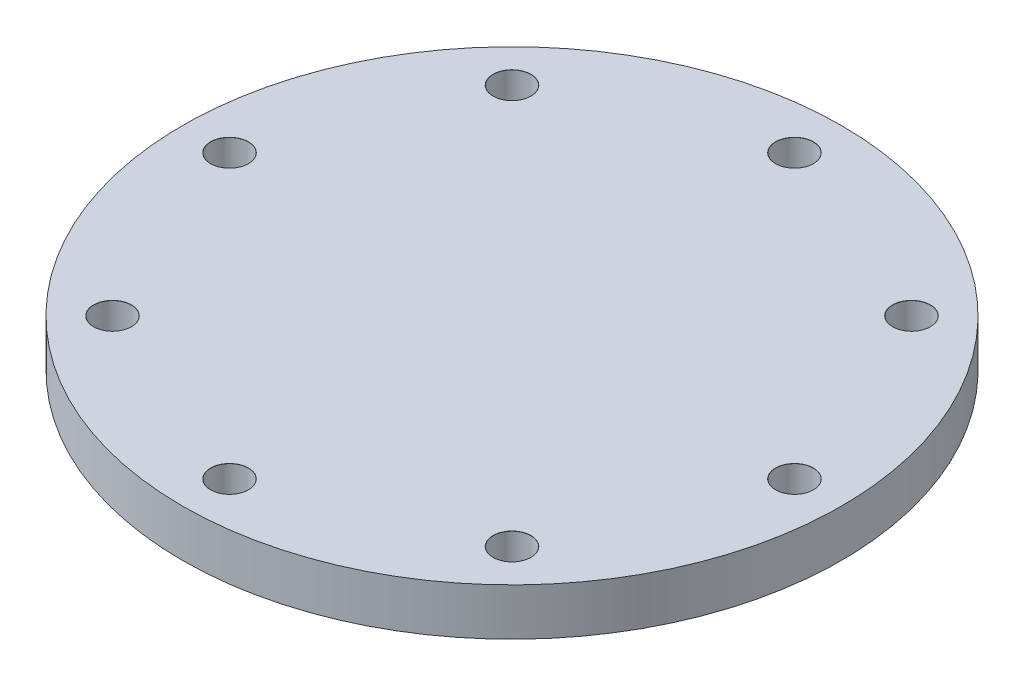
ISO-10303-21;
HEADER;
FILE_DESCRIPTION(('STEP AP214'),'2;1');
FILE_NAME('part.step','',(''),(''),'','','');
FILE_SCHEMA(('AUTOMOTIVE_DESIGN { 1 0 10303 214 1 1 1 1 }'));
ENDSEC;
DATA;
#1=APPLICATION_CONTEXT('core data for automotive mechanical design processes');
#2=APPLICATION_PROTOCOL_DEFINITION('international standard','automotive_design',2000,#1);
#3=PRODUCT_CONTEXT('',#1,'mechanical');
#4=PRODUCT('Part','Part','',(#3));
#5=PRODUCT_RELATED_PRODUCT_CATEGORY('part','',(#4));
#6=PRODUCT_DEFINITION_FORMATION('','',#4);
#7=PRODUCT_DEFINITION_CONTEXT('part definition',#1,'design');
#8=PRODUCT_DEFINITION('design','',#6,#7);
#9=PRODUCT_DEFINITION_SHAPE('','',#8);
#10=(LENGTH_UNIT() NAMED_UNIT(*) SI_UNIT(.MILLI.,.METRE.));
#11=(NAMED_UNIT(*) PLANE_ANGLE_UNIT() SI_UNIT($,.RADIAN.));
#12=(NAMED_UNIT(*) SI_UNIT($,.STERADIAN.) SOLID_ANGLE_UNIT());
#13=UNCERTAINTY_MEASURE_WITH_UNIT(LENGTH_MEASURE(1.E-05),#10,'distance_accuracy_value','');
#14=(GEOMETRIC_REPRESENTATION_CONTEXT(3) GLOBAL_UNCERTAINTY_ASSIGNED_CONTEXT((#13)) GLOBAL_UNIT_ASSIGNED_CONTEXT((#10,
#11,#12)) REPRESENTATION_CONTEXT('',''));
#15=CARTESIAN_POINT('',(0.,0.,0.));
#16=DIRECTION('',(0.,0.,1.));
#17=DIRECTION('',(1.,0.,0.));
#18=AXIS2_PLACEMENT_3D('',#15,#16,#17);
#19=CARTESIAN_POINT('',(0.,9.99999999999999,0.));
#20=DIRECTION('',(0.,1.,0.));
#21=DIRECTION('',(0.,0.,1.));
#22=AXIS2_PLACEMENT_3D('',#19,#20,#21);
#23=PLANE('',#22);
#24=CARTESIAN_POINT('',(-42.4264068711934,9.99999999999999,42.4264068711923));
#25=DIRECTION('',(0.,1.,0.));
#26=DIRECTION('',(0.,0.,1.));
#27=AXIS2_PLACEMENT_3D('',#24,#25,#26);
#28=CIRCLE('',#27,4.025);
#29=CARTESIAN_POINT('',(-42.4264068711934,9.99999999999999,46.4514068711923));
#30=VERTEX_POINT('',#29);
#31=EDGE_CURVE('E118',#30,#30,#28,.T.);
#32=ORIENTED_EDGE('',*,*,#31,.F.);
#33=EDGE_LOOP('',(#32));
#34=FACE_BOUND('',#33,.T.);
#35=CARTESIAN_POINT('',(-6.28466640991764E-13,9.99999999999999,60.));
#36=DIRECTION('',(0.,1.,0.));
#37=DIRECTION('',(0.,0.,1.));
#38=AXIS2_PLACEMENT_3D('',#35,#36,#37);
#39=CIRCLE('',#38,4.025);
#40=CARTESIAN_POINT('',(-6.28466640991764E-13,9.99999999999999,64.025));
#41=VERTEX_POINT('',#40);
#42=EDGE_CURVE('E109',#41,#41,#39,.T.);
#43=ORIENTED_EDGE('',*,*,#42,.F.);
#44=EDGE_LOOP('',(#43));
#45=FACE_BOUND('',#44,.T.);
#46=CARTESIAN_POINT('',(42.4264068711925,9.99999999999999,42.4264068711932));
#47=DIRECTION('',(0.,1.,0.));
#48=DIRECTION('',(0.,0.,1.));
#49=AXIS2_PLACEMENT_3D('',#46,#47,#48);
#50=CIRCLE('',#49,4.025);
#51=CARTESIAN_POINT('',(42.4264068711925,9.99999999999999,46.4514068711932));
#52=VERTEX_POINT('',#51);
#53=EDGE_CURVE('E100',#52,#52,#50,.T.);
#54=ORIENTED_EDGE('',*,*,#53,.F.);
#55=EDGE_LOOP('',(#54));
#56=FACE_BOUND('',#55,.T.);
#57=CARTESIAN_POINT('',(60.,9.99999999999999,0.));
#58=DIRECTION('',(0.,1.,0.));
#59=DIRECTION('',(0.,0.,1.));
#60=AXIS2_PLACEMENT_3D('',#57,#58,#59);
#61=CIRCLE('',#60,4.025);
#62=CARTESIAN_POINT('',(60.,9.99999999999999,4.025));
#63=VERTEX_POINT('',#62);
#64=EDGE_CURVE('E91',#63,#63,#61,.T.);
#65=ORIENTED_EDGE('',*,*,#64,.F.);
#66=EDGE_LOOP('',(#65));
#67=FACE_BOUND('',#66,.T.);
#68=CARTESIAN_POINT('',(42.4264068711931,9.99999999999999,-42.4264068711926));
#69=DIRECTION('',(0.,1.,0.));
#70=DIRECTION('',(0.,0.,1.));
#71=AXIS2_PLACEMENT_3D('',#68,#69,#70);
#72=CIRCLE('',#71,4.025);
#73=CARTESIAN_POINT('',(42.4264068711931,9.99999999999999,-38.4014068711926));
#74=VERTEX_POINT('',#73);
#75=EDGE_CURVE('E82',#74,#74,#72,.T.);
#76=ORIENTED_EDGE('',*,*,#75,.F.);
#77=EDGE_LOOP('',(#76));
#78=FACE_BOUND('',#77,.T.);
#79=CARTESIAN_POINT('',(2.09488880330588E-13,9.99999999999999,-60.));
#80=DIRECTION('',(0.,1.,0.));
#81=DIRECTION('',(0.,0.,1.));
#82=AXIS2_PLACEMENT_3D('',#79,#80,#81);
#83=CIRCLE('',#82,4.025);
#84=CARTESIAN_POINT('',(2.09488880330588E-13,9.99999999999999,-55.975));
#85=VERTEX_POINT('',#84);
#86=EDGE_CURVE('E73',#85,#85,#83,.T.);
#87=ORIENTED_EDGE('',*,*,#86,.F.);
#88=EDGE_LOOP('',(#87));
#89=FACE_BOUND('',#88,.T.);
#90=CARTESIAN_POINT('',(-42.4264068711928,9.99999999999999,-42.4264068711929));
#91=DIRECTION('',(0.,1.,0.));
#92=DIRECTION('',(0.,0.,1.));
#93=AXIS2_PLACEMENT_3D('',#90,#91,#92);
#94=CIRCLE('',#93,4.025);
#95=CARTESIAN_POINT('',(-42.4264068711928,9.99999999999999,-38.4014068711929));
#96=VERTEX_POINT('',#95);
#97=EDGE_CURVE('E64',#96,#96,#94,.T.);
#98=ORIENTED_EDGE('',*,*,#97,.F.);
#99=EDGE_LOOP('',(#98));
#100=FACE_BOUND('',#99,.T.);
#101=CARTESIAN_POINT('',(-60.,9.99999999999999,0.));
#102=DIRECTION('',(0.,1.,0.));
#103=DIRECTION('',(0.,0.,1.));
#104=AXIS2_PLACEMENT_3D('',#101,#102,#103);
#105=CIRCLE('',#104,4.025);
#106=CARTESIAN_POINT('',(-60.,9.99999999999999,4.025));
#107=VERTEX_POINT('',#106);
#108=EDGE_CURVE('E55',#107,#107,#105,.T.);
#109=ORIENTED_EDGE('',*,*,#108,.F.);
#110=EDGE_LOOP('',(#109));
#111=FACE_BOUND('',#110,.T.);
#112=CARTESIAN_POINT('',(0.,9.99999999999999,0.));
#113=DIRECTION('',(0.,1.,0.));
#114=DIRECTION('',(0.,0.,1.));
#115=AXIS2_PLACEMENT_3D('',#112,#113,#114);
#116=CIRCLE('',#115,70.);
#117=CARTESIAN_POINT('',(0.,9.99999999999999,70.));
#118=VERTEX_POINT('',#117);
#119=EDGE_CURVE('E10',#118,#118,#116,.T.);
#120=ORIENTED_EDGE('',*,*,#119,.T.);
#121=EDGE_LOOP('',(#120));
#122=FACE_BOUND('',#121,.T.);
#123=ADVANCED_FACE('F36',(#34,#45,#56,#67,#78,#89,#100,#111,#122),#23,.T.);
#124=CARTESIAN_POINT('',(0.,76.6194972326676,0.));
#125=DIRECTION('',(0.,1.,0.));
#126=DIRECTION('',(0.,0.,1.));
#127=AXIS2_PLACEMENT_3D('',#124,#125,#126);
#128=CYLINDRICAL_SURFACE('',#127,70.);
#129=CARTESIAN_POINT('',(0.,0.,0.));
#130=DIRECTION('',(0.,1.,0.));
#131=DIRECTION('',(0.,0.,1.));
#132=AXIS2_PLACEMENT_3D('',#129,#130,#131);
#133=CIRCLE('',#132,70.);
#134=CARTESIAN_POINT('',(0.,0.,70.));
#135=VERTEX_POINT('',#134);
#136=EDGE_CURVE('E42',#135,#135,#133,.T.);
#137=ORIENTED_EDGE('',*,*,#136,.T.);
#138=EDGE_LOOP('',(#137));
#139=FACE_BOUND('',#138,.T.);
#140=ORIENTED_EDGE('',*,*,#119,.F.);
#141=EDGE_LOOP('',(#140));
#142=FACE_BOUND('',#141,.T.);
#143=ADVANCED_FACE('F126',(#139,#142),#128,.T.);
#144=CARTESIAN_POINT('',(0.,0.,0.));
#145=DIRECTION('',(0.,-1.,0.));
#146=DIRECTION('',(0.,0.,-1.));
#147=AXIS2_PLACEMENT_3D('',#144,#145,#146);
#148=PLANE('',#147);
#149=CARTESIAN_POINT('',(-42.4264068711934,0.,42.4264068711923));
#150=DIRECTION('',(0.,1.,0.));
#151=DIRECTION('',(0.,0.,1.));
#152=AXIS2_PLACEMENT_3D('',#149,#150,#151);
#153=CIRCLE('',#152,4.);
#154=CARTESIAN_POINT('',(-42.4264068711934,0.,46.4264068711923));
#155=VERTEX_POINT('',#154);
#156=EDGE_CURVE('E112',#155,#155,#153,.T.);
#157=ORIENTED_EDGE('',*,*,#156,.T.);
#158=EDGE_LOOP('',(#157));
#159=FACE_BOUND('',#158,.T.);
#160=CARTESIAN_POINT('',(-6.28466640991764E-13,0.,60.));
#161=DIRECTION('',(0.,1.,0.));
#162=DIRECTION('',(0.,0.,1.));
#163=AXIS2_PLACEMENT_3D('',#160,#161,#162);
#164=CIRCLE('',#163,4.);
#165=CARTESIAN_POINT('',(-6.28466640991764E-13,0.,64.));
#166=VERTEX_POINT('',#165);
#167=EDGE_CURVE('E103',#166,#166,#164,.T.);
#168=ORIENTED_EDGE('',*,*,#167,.T.);
#169=EDGE_LOOP('',(#168));
#170=FACE_BOUND('',#169,.T.);
#171=CARTESIAN_POINT('',(42.4264068711925,0.,42.4264068711932));
#172=DIRECTION('',(0.,1.,0.));
#173=DIRECTION('',(0.,0.,1.));
#174=AXIS2_PLACEMENT_3D('',#171,#172,#173);
#175=CIRCLE('',#174,4.);
#176=CARTESIAN_POINT('',(42.4264068711925,0.,46.4264068711932));
#177=VERTEX_POINT('',#176);
#178=EDGE_CURVE('E94',#177,#177,#175,.T.);
#179=ORIENTED_EDGE('',*,*,#178,.T.);
#180=EDGE_LOOP('',(#179));
#181=FACE_BOUND('',#180,.T.);
#182=CARTESIAN_POINT('',(60.,0.,0.));
#183=DIRECTION('',(0.,1.,0.));
#184=DIRECTION('',(0.,0.,1.));
#185=AXIS2_PLACEMENT_3D('',#182,#183,#184);
#186=CIRCLE('',#185,4.);
#187=CARTESIAN_POINT('',(60.,0.,4.));
#188=VERTEX_POINT('',#187);
#189=EDGE_CURVE('E85',#188,#188,#186,.T.);
#190=ORIENTED_EDGE('',*,*,#189,.T.);
#191=EDGE_LOOP('',(#190));
#192=FACE_BOUND('',#191,.T.);
#193=CARTESIAN_POINT('',(42.4264068711931,0.,-42.4264068711926));
#194=DIRECTION('',(0.,1.,0.));
#195=DIRECTION('',(0.,0.,1.));
#196=AXIS2_PLACEMENT_3D('',#193,#194,#195);
#197=CIRCLE('',#196,4.);
#198=CARTESIAN_POINT('',(42.4264068711931,0.,-38.4264068711926));
#199=VERTEX_POINT('',#198);
#200=EDGE_CURVE('E76',#199,#199,#197,.T.);
#201=ORIENTED_EDGE('',*,*,#200,.T.);
#202=EDGE_LOOP('',(#201));
#203=FACE_BOUND('',#202,.T.);
#204=CARTESIAN_POINT('',(2.09488880330588E-13,0.,-60.));
#205=DIRECTION('',(0.,1.,0.));
#206=DIRECTION('',(0.,0.,1.));
#207=AXIS2_PLACEMENT_3D('',#204,#205,#206);
#208=CIRCLE('',#207,4.);
#209=CARTESIAN_POINT('',(2.09488880330588E-13,0.,-56.));
#210=VERTEX_POINT('',#209);
#211=EDGE_CURVE('E67',#210,#210,#208,.T.);
#212=ORIENTED_EDGE('',*,*,#211,.T.);
#213=EDGE_LOOP('',(#212));
#214=FACE_BOUND('',#213,.T.);
#215=CARTESIAN_POINT('',(-42.4264068711928,0.,-42.4264068711929));
#216=DIRECTION('',(0.,1.,0.));
#217=DIRECTION('',(0.,0.,1.));
#218=AXIS2_PLACEMENT_3D('',#215,#216,#217);
#219=CIRCLE('',#218,4.);
#220=CARTESIAN_POINT('',(-42.4264068711928,0.,-38.4264068711929));
#221=VERTEX_POINT('',#220);
#222=EDGE_CURVE('E58',#221,#221,#219,.T.);
#223=ORIENTED_EDGE('',*,*,#222,.T.);
#224=EDGE_LOOP('',(#223));
#225=FACE_BOUND('',#224,.T.);
#226=CARTESIAN_POINT('',(-60.,0.,0.));
#227=DIRECTION('',(0.,1.,0.));
#228=DIRECTION('',(0.,0.,1.));
#229=AXIS2_PLACEMENT_3D('',#226,#227,#228);
#230=CIRCLE('',#229,4.);
#231=CARTESIAN_POINT('',(-60.,0.,4.));
#232=VERTEX_POINT('',#231);
#233=EDGE_CURVE('E46',#232,#232,#230,.T.);
#234=ORIENTED_EDGE('',*,*,#233,.T.);
#235=EDGE_LOOP('',(#234));
#236=FACE_BOUND('',#235,.T.);
#237=ORIENTED_EDGE('',*,*,#136,.F.);
#238=EDGE_LOOP('',(#237));
#239=FACE_BOUND('',#238,.T.);
#240=ADVANCED_FACE('F154',(#159,#170,#181,#192,#203,#214,#225,#236,#239),#148,.T.);
#241=CARTESIAN_POINT('',(-60.,9.99999999999999,0.));
#242=DIRECTION('',(0.,1.,0.));
#243=DIRECTION('',(0.,0.,1.));
#244=AXIS2_PLACEMENT_3D('',#241,#242,#243);
#245=CYLINDRICAL_SURFACE('',#244,4.);
#246=ORIENTED_EDGE('',*,*,#233,.F.);
#247=EDGE_LOOP('',(#246));
#248=FACE_BOUND('',#247,.T.);
#249=CARTESIAN_POINT('',(-60.,9.97902250922059,0.));
#250=DIRECTION('',(0.,1.,0.));
#251=DIRECTION('',(0.,0.,1.));
#252=AXIS2_PLACEMENT_3D('',#249,#250,#251);
#253=CIRCLE('',#252,4.);
#254=CARTESIAN_POINT('',(-60.,9.97902250922059,4.));
#255=VERTEX_POINT('',#254);
#256=EDGE_CURVE('E50',#255,#255,#253,.T.);
#257=ORIENTED_EDGE('',*,*,#256,.T.);
#258=EDGE_LOOP('',(#257));
#259=FACE_BOUND('',#258,.T.);
#260=ADVANCED_FACE('F144',(#248,#259),#245,.F.);
#261=CARTESIAN_POINT('',(-60.,9.99999999999999,0.));
#262=DIRECTION('',(0.,1.,0.));
#263=DIRECTION('',(0.,0.,1.));
#264=AXIS2_PLACEMENT_3D('',#261,#262,#263);
#265=CONICAL_SURFACE('',#264,4.025,0.87266462599766);
#266=ORIENTED_EDGE('',*,*,#256,.F.);
#267=EDGE_LOOP('',(#266));
#268=FACE_BOUND('',#267,.T.);
#269=ORIENTED_EDGE('',*,*,#108,.T.);
#270=EDGE_LOOP('',(#269));
#271=FACE_BOUND('',#270,.T.);
#272=ADVANCED_FACE('F141',(#268,#271),#265,.F.);
#273=CARTESIAN_POINT('',(-42.4264068711928,9.99999999999999,-42.4264068711929));
#274=DIRECTION('',(0.,1.,0.));
#275=DIRECTION('',(0.,0.,1.));
#276=AXIS2_PLACEMENT_3D('',#273,#274,#275);
#277=CYLINDRICAL_SURFACE('',#276,4.);
#278=ORIENTED_EDGE('',*,*,#222,.F.);
#279=EDGE_LOOP('',(#278));
#280=FACE_BOUND('',#279,.T.);
#281=CARTESIAN_POINT('',(-42.4264068711928,9.97902250922059,-42.4264068711929));
#282=DIRECTION('',(0.,1.,0.));
#283=DIRECTION('',(0.,0.,1.));
#284=AXIS2_PLACEMENT_3D('',#281,#282,#283);
#285=CIRCLE('',#284,4.);
#286=CARTESIAN_POINT('',(-42.4264068711928,9.97902250922059,-38.4264068711929));
#287=VERTEX_POINT('',#286);
#288=EDGE_CURVE('E61',#287,#287,#285,.T.);
#289=ORIENTED_EDGE('',*,*,#288,.T.);
#290=EDGE_LOOP('',(#289));
#291=FACE_BOUND('',#290,.T.);
#292=ADVANCED_FACE('F143',(#280,#291),#277,.F.);
#293=CARTESIAN_POINT('',(-42.4264068711928,9.99999999999999,-42.4264068711929));
#294=DIRECTION('',(0.,1.,0.));
#295=DIRECTION('',(0.,0.,1.));
#296=AXIS2_PLACEMENT_3D('',#293,#294,#295);
#297=CONICAL_SURFACE('',#296,4.025,0.872664625997797);
#298=ORIENTED_EDGE('',*,*,#288,.F.);
#299=EDGE_LOOP('',(#298));
#300=FACE_BOUND('',#299,.T.);
#301=ORIENTED_EDGE('',*,*,#97,.T.);
#302=EDGE_LOOP('',(#301));
#303=FACE_BOUND('',#302,.T.);
#304=ADVANCED_FACE('F151',(#300,#303),#297,.F.);
#305=CARTESIAN_POINT('',(2.09488880330588E-13,9.99999999999999,-60.));
#306=DIRECTION('',(0.,1.,0.));
#307=DIRECTION('',(0.,0.,1.));
#308=AXIS2_PLACEMENT_3D('',#305,#306,#307);
#309=CYLINDRICAL_SURFACE('',#308,4.);
#310=ORIENTED_EDGE('',*,*,#211,.F.);
#311=EDGE_LOOP('',(#310));
#312=FACE_BOUND('',#311,.T.);
#313=CARTESIAN_POINT('',(2.09488880330588E-13,9.97902250922059,-60.));
#314=DIRECTION('',(0.,1.,0.));
#315=DIRECTION('',(0.,0.,1.));
#316=AXIS2_PLACEMENT_3D('',#313,#314,#315);
#317=CIRCLE('',#316,4.);
#318=CARTESIAN_POINT('',(2.09488880330588E-13,9.97902250922059,-56.));
#319=VERTEX_POINT('',#318);
#320=EDGE_CURVE('E70',#319,#319,#317,.T.);
#321=ORIENTED_EDGE('',*,*,#320,.T.);
#322=EDGE_LOOP('',(#321));
#323=FACE_BOUND('',#322,.T.);
#324=ADVANCED_FACE('F189',(#312,#323),#309,.F.);
#325=CARTESIAN_POINT('',(2.09488880330588E-13,9.99999999999999,-60.));
#326=DIRECTION('',(0.,1.,0.));
#327=DIRECTION('',(0.,0.,1.));
#328=AXIS2_PLACEMENT_3D('',#325,#326,#327);
#329=CONICAL_SURFACE('',#328,4.025,0.872664625997729);
#330=ORIENTED_EDGE('',*,*,#320,.F.);
#331=EDGE_LOOP('',(#330));
#332=FACE_BOUND('',#331,.T.);
#333=ORIENTED_EDGE('',*,*,#86,.T.);
#334=EDGE_LOOP('',(#333));
#335=FACE_BOUND('',#334,.T.);
#336=ADVANCED_FACE('F196',(#332,#335),#329,.F.);
#337=CARTESIAN_POINT('',(42.4264068711931,9.99999999999999,-42.4264068711926));
#338=DIRECTION('',(0.,1.,0.));
#339=DIRECTION('',(0.,0.,1.));
#340=AXIS2_PLACEMENT_3D('',#337,#338,#339);
#341=CYLINDRICAL_SURFACE('',#340,4.);
#342=ORIENTED_EDGE('',*,*,#200,.F.);
#343=EDGE_LOOP('',(#342));
#344=FACE_BOUND('',#343,.T.);
#345=CARTESIAN_POINT('',(42.4264068711931,9.97902250922059,-42.4264068711926));
#346=DIRECTION('',(0.,1.,0.));
#347=DIRECTION('',(0.,0.,1.));
#348=AXIS2_PLACEMENT_3D('',#345,#346,#347);
#349=CIRCLE('',#348,4.);
#350=CARTESIAN_POINT('',(42.4264068711931,9.97902250922059,-38.4264068711926));
#351=VERTEX_POINT('',#350);
#352=EDGE_CURVE('E79',#351,#351,#349,.T.);
#353=ORIENTED_EDGE('',*,*,#352,.T.);
#354=EDGE_LOOP('',(#353));
#355=FACE_BOUND('',#354,.T.);
#356=ADVANCED_FACE('F201',(#344,#355),#341,.F.);
#357=CARTESIAN_POINT('',(42.4264068711931,9.99999999999999,-42.4264068711926));
#358=DIRECTION('',(0.,1.,0.));
#359=DIRECTION('',(0.,0.,1.));
#360=AXIS2_PLACEMENT_3D('',#357,#358,#359);
#361=CONICAL_SURFACE('',#360,4.025,0.87266462599766);
#362=ORIENTED_EDGE('',*,*,#352,.F.);
#363=EDGE_LOOP('',(#362));
#364=FACE_BOUND('',#363,.T.);
#365=ORIENTED_EDGE('',*,*,#75,.T.);
#366=EDGE_LOOP('',(#365));
#367=FACE_BOUND('',#366,.T.);
#368=ADVANCED_FACE('F209',(#364,#367),#361,.F.);
#369=CARTESIAN_POINT('',(60.,9.99999999999999,0.));
#370=DIRECTION('',(0.,1.,0.));
#371=DIRECTION('',(0.,0.,1.));
#372=AXIS2_PLACEMENT_3D('',#369,#370,#371);
#373=CYLINDRICAL_SURFACE('',#372,4.);
#374=ORIENTED_EDGE('',*,*,#189,.F.);
#375=EDGE_LOOP('',(#374));
#376=FACE_BOUND('',#375,.T.);
#377=CARTESIAN_POINT('',(60.,9.97902250922059,0.));
#378=DIRECTION('',(0.,1.,0.));
#379=DIRECTION('',(0.,0.,1.));
#380=AXIS2_PLACEMENT_3D('',#377,#378,#379);
#381=CIRCLE('',#380,4.);
#382=CARTESIAN_POINT('',(60.,9.97902250922059,4.));
#383=VERTEX_POINT('',#382);
#384=EDGE_CURVE('E88',#383,#383,#381,.T.);
#385=ORIENTED_EDGE('',*,*,#384,.T.);
#386=EDGE_LOOP('',(#385));
#387=FACE_BOUND('',#386,.T.);
#388=ADVANCED_FACE('F214',(#376,#387),#373,.F.);
#389=CARTESIAN_POINT('',(60.,9.99999999999999,0.));
#390=DIRECTION('',(0.,1.,0.));
#391=DIRECTION('',(0.,0.,1.));
#392=AXIS2_PLACEMENT_3D('',#389,#390,#391);
#393=CONICAL_SURFACE('',#392,4.025,0.87266462599766);
#394=ORIENTED_EDGE('',*,*,#384,.F.);
#395=EDGE_LOOP('',(#394));
#396=FACE_BOUND('',#395,.T.);
#397=ORIENTED_EDGE('',*,*,#64,.T.);
#398=EDGE_LOOP('',(#397));
#399=FACE_BOUND('',#398,.T.);
#400=ADVANCED_FACE('F222',(#396,#399),#393,.F.);
#401=CARTESIAN_POINT('',(42.4264068711925,9.99999999999999,42.4264068711932));
#402=DIRECTION('',(0.,1.,0.));
#403=DIRECTION('',(0.,0.,1.));
#404=AXIS2_PLACEMENT_3D('',#401,#402,#403);
#405=CYLINDRICAL_SURFACE('',#404,4.);
#406=ORIENTED_EDGE('',*,*,#178,.F.);
#407=EDGE_LOOP('',(#406));
#408=FACE_BOUND('',#407,.T.);
#409=CARTESIAN_POINT('',(42.4264068711925,9.97902250922059,42.4264068711932));
#410=DIRECTION('',(0.,1.,0.));
#411=DIRECTION('',(0.,0.,1.));
#412=AXIS2_PLACEMENT_3D('',#409,#410,#411);
#413=CIRCLE('',#412,4.);
#414=CARTESIAN_POINT('',(42.4264068711925,9.97902250922059,46.4264068711932));
#415=VERTEX_POINT('',#414);
#416=EDGE_CURVE('E97',#415,#415,#413,.T.);
#417=ORIENTED_EDGE('',*,*,#416,.T.);
#418=EDGE_LOOP('',(#417));
#419=FACE_BOUND('',#418,.T.);
#420=ADVANCED_FACE('F227',(#408,#419),#405,.F.);
#421=CARTESIAN_POINT('',(42.4264068711925,9.99999999999999,42.4264068711932));
#422=DIRECTION('',(0.,1.,0.));
#423=DIRECTION('',(0.,0.,1.));
#424=AXIS2_PLACEMENT_3D('',#421,#422,#423);
#425=CONICAL_SURFACE('',#424,4.025,0.87266462599766);
#426=ORIENTED_EDGE('',*,*,#416,.F.);
#427=EDGE_LOOP('',(#426));
#428=FACE_BOUND('',#427,.T.);
#429=ORIENTED_EDGE('',*,*,#53,.T.);
#430=EDGE_LOOP('',(#429));
#431=FACE_BOUND('',#430,.T.);
#432=ADVANCED_FACE('F235',(#428,#431),#425,.F.);
#433=CARTESIAN_POINT('',(-6.28466640991764E-13,9.99999999999999,60.));
#434=DIRECTION('',(0.,1.,0.));
#435=DIRECTION('',(0.,0.,1.));
#436=AXIS2_PLACEMENT_3D('',#433,#434,#435);
#437=CYLINDRICAL_SURFACE('',#436,4.);
#438=ORIENTED_EDGE('',*,*,#167,.F.);
#439=EDGE_LOOP('',(#438));
#440=FACE_BOUND('',#439,.T.);
#441=CARTESIAN_POINT('',(-6.28466640991764E-13,9.97902250922059,60.));
#442=DIRECTION('',(0.,1.,0.));
#443=DIRECTION('',(0.,0.,1.));
#444=AXIS2_PLACEMENT_3D('',#441,#442,#443);
#445=CIRCLE('',#444,4.);
#446=CARTESIAN_POINT('',(-6.28466640991764E-13,9.97902250922059,64.));
#447=VERTEX_POINT('',#446);
#448=EDGE_CURVE('E106',#447,#447,#445,.T.);
#449=ORIENTED_EDGE('',*,*,#448,.T.);
#450=EDGE_LOOP('',(#449));
#451=FACE_BOUND('',#450,.T.);
#452=ADVANCED_FACE('F240',(#440,#451),#437,.F.);
#453=CARTESIAN_POINT('',(-6.28466640991764E-13,9.99999999999999,60.));
#454=DIRECTION('',(0.,1.,0.));
#455=DIRECTION('',(0.,0.,1.));
#456=AXIS2_PLACEMENT_3D('',#453,#454,#455);
#457=CONICAL_SURFACE('',#456,4.025,0.872664625997729);
#458=ORIENTED_EDGE('',*,*,#448,.F.);
#459=EDGE_LOOP('',(#458));
#460=FACE_BOUND('',#459,.T.);
#461=ORIENTED_EDGE('',*,*,#42,.T.);
#462=EDGE_LOOP('',(#461));
#463=FACE_BOUND('',#462,.T.);
#464=ADVANCED_FACE('F248',(#460,#463),#457,.F.);
#465=CARTESIAN_POINT('',(-42.4264068711934,9.99999999999999,42.4264068711923));
#466=DIRECTION('',(0.,1.,0.));
#467=DIRECTION('',(0.,0.,1.));
#468=AXIS2_PLACEMENT_3D('',#465,#466,#467);
#469=CYLINDRICAL_SURFACE('',#468,4.);
#470=ORIENTED_EDGE('',*,*,#156,.F.);
#471=EDGE_LOOP('',(#470));
#472=FACE_BOUND('',#471,.T.);
#473=CARTESIAN_POINT('',(-42.4264068711934,9.97902250922059,42.4264068711923));
#474=DIRECTION('',(0.,1.,0.));
#475=DIRECTION('',(0.,0.,1.));
#476=AXIS2_PLACEMENT_3D('',#473,#474,#475);
#477=CIRCLE('',#476,4.);
#478=CARTESIAN_POINT('',(-42.4264068711934,9.97902250922059,46.4264068711923));
#479=VERTEX_POINT('',#478);
#480=EDGE_CURVE('E115',#479,#479,#477,.T.);
#481=ORIENTED_EDGE('',*,*,#480,.T.);
#482=EDGE_LOOP('',(#481));
#483=FACE_BOUND('',#482,.T.);
#484=ADVANCED_FACE('F253',(#472,#483),#469,.F.);
#485=CARTESIAN_POINT('',(-42.4264068711934,9.99999999999999,42.4264068711923));
#486=DIRECTION('',(0.,1.,0.));
#487=DIRECTION('',(0.,0.,1.));
#488=AXIS2_PLACEMENT_3D('',#485,#486,#487);
#489=CONICAL_SURFACE('',#488,4.025,0.87266462599766);
#490=ORIENTED_EDGE('',*,*,#480,.F.);
#491=EDGE_LOOP('',(#490));
#492=FACE_BOUND('',#491,.T.);
#493=ORIENTED_EDGE('',*,*,#31,.T.);
#494=EDGE_LOOP('',(#493));
#495=FACE_BOUND('',#494,.T.);
#496=ADVANCED_FACE('F122',(#492,#495),#489,.F.);
#497=CLOSED_SHELL('',(#123,#143,#240,#260,#272,#292,#304,#324,#336,#356,#368,#388,#400,#420,
#432,#452,#464,#484,#496));
#498=MANIFOLD_SOLID_BREP('B2',#497);
#499=ADVANCED_BREP_SHAPE_REPRESENTATION('',(#18,#498),#14);
#500=SHAPE_DEFINITION_REPRESENTATION(#9,#499);
ENDSEC;
END-ISO-10303-21;
